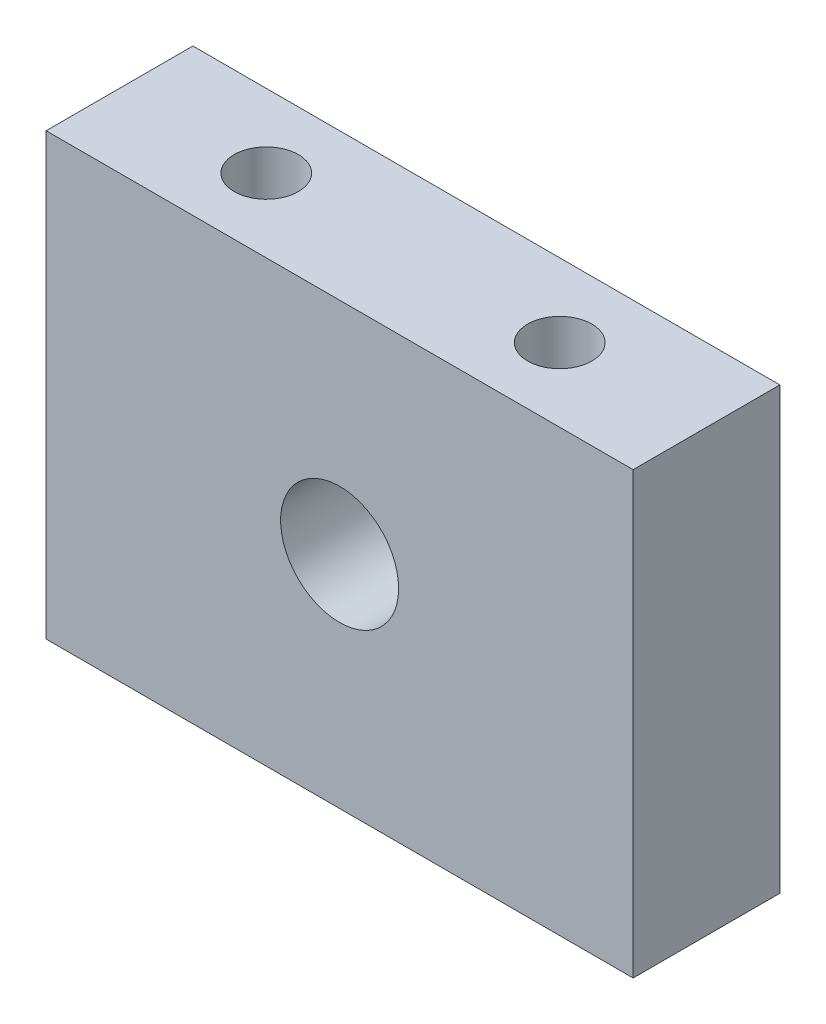
ISO-10303-21;
HEADER;
FILE_DESCRIPTION(('STEP AP214'),'2;1');
FILE_NAME('part.step','',(''),(''),'','','');
FILE_SCHEMA(('AUTOMOTIVE_DESIGN { 1 0 10303 214 1 1 1 1 }'));
ENDSEC;
DATA;
#1=APPLICATION_CONTEXT('core data for automotive mechanical design processes');
#2=APPLICATION_PROTOCOL_DEFINITION('international standard','automotive_design',2000,#1);
#3=PRODUCT_CONTEXT('',#1,'mechanical');
#4=PRODUCT('Part','Part','',(#3));
#5=PRODUCT_RELATED_PRODUCT_CATEGORY('part','',(#4));
#6=PRODUCT_DEFINITION_FORMATION('','',#4);
#7=PRODUCT_DEFINITION_CONTEXT('part definition',#1,'design');
#8=PRODUCT_DEFINITION('design','',#6,#7);
#9=PRODUCT_DEFINITION_SHAPE('','',#8);
#10=(LENGTH_UNIT() NAMED_UNIT(*) SI_UNIT(.MILLI.,.METRE.));
#11=(NAMED_UNIT(*) PLANE_ANGLE_UNIT() SI_UNIT($,.RADIAN.));
#12=(NAMED_UNIT(*) SI_UNIT($,.STERADIAN.) SOLID_ANGLE_UNIT());
#13=UNCERTAINTY_MEASURE_WITH_UNIT(LENGTH_MEASURE(1.E-05),#10,'distance_accuracy_value','');
#14=(GEOMETRIC_REPRESENTATION_CONTEXT(3) GLOBAL_UNCERTAINTY_ASSIGNED_CONTEXT((#13)) GLOBAL_UNIT_ASSIGNED_CONTEXT((#10,
#11,#12)) REPRESENTATION_CONTEXT('',''));
#15=CARTESIAN_POINT('',(0.,0.,0.));
#16=DIRECTION('',(0.,0.,1.));
#17=DIRECTION('',(1.,0.,0.));
#18=AXIS2_PLACEMENT_3D('',#15,#16,#17);
#19=CARTESIAN_POINT('',(12.7,9.525,3.175));
#20=DIRECTION('',(-1.,0.,0.));
#21=DIRECTION('',(0.,-1.,0.));
#22=AXIS2_PLACEMENT_3D('',#19,#20,#21);
#23=PLANE('',#22);
#24=DIRECTION('',(0.,1.,0.));
#25=VECTOR('',#24,1.);
#26=CARTESIAN_POINT('',(12.7,9.525,-3.175));
#27=LINE('',#26,#25);
#28=CARTESIAN_POINT('',(12.7,-9.525,-3.175));
#29=VERTEX_POINT('',#28);
#30=CARTESIAN_POINT('',(12.7,9.525,-3.175));
#31=VERTEX_POINT('',#30);
#32=EDGE_CURVE('E96',#29,#31,#27,.T.);
#33=ORIENTED_EDGE('',*,*,#32,.T.);
#34=DIRECTION('',(0.,0.,-1.));
#35=VECTOR('',#34,1.);
#36=CARTESIAN_POINT('',(12.7,9.525,3.175));
#37=LINE('',#36,#35);
#38=CARTESIAN_POINT('',(12.7,9.525,3.175));
#39=VERTEX_POINT('',#38);
#40=EDGE_CURVE('E11',#39,#31,#37,.T.);
#41=ORIENTED_EDGE('',*,*,#40,.F.);
#42=DIRECTION('',(0.,1.,0.));
#43=VECTOR('',#42,1.);
#44=CARTESIAN_POINT('',(12.7,9.525,3.175));
#45=LINE('',#44,#43);
#46=CARTESIAN_POINT('',(12.7,-9.525,3.175));
#47=VERTEX_POINT('',#46);
#48=EDGE_CURVE('E84',#47,#39,#45,.T.);
#49=ORIENTED_EDGE('',*,*,#48,.F.);
#50=DIRECTION('',(0.,0.,-1.));
#51=VECTOR('',#50,1.);
#52=CARTESIAN_POINT('',(12.7,-9.525,3.175));
#53=LINE('',#52,#51);
#54=EDGE_CURVE('E92',#47,#29,#53,.T.);
#55=ORIENTED_EDGE('',*,*,#54,.T.);
#56=EDGE_LOOP('',(#33,#41,#49,#55));
#57=FACE_BOUND('',#56,.T.);
#58=ADVANCED_FACE('F33',(#57),#23,.F.);
#59=CARTESIAN_POINT('',(-12.7,9.525,3.175));
#60=DIRECTION('',(0.,-1.,0.));
#61=DIRECTION('',(0.,0.,-1.));
#62=AXIS2_PLACEMENT_3D('',#59,#60,#61);
#63=PLANE('',#62);
#64=CARTESIAN_POINT('',(6.35,9.525,0.));
#65=DIRECTION('',(0.,1.,0.));
#66=DIRECTION('',(0.,0.,-1.));
#67=AXIS2_PLACEMENT_3D('',#64,#65,#66);
#68=CIRCLE('',#67,1.3890625);
#69=CARTESIAN_POINT('',(6.35,9.525,-1.3890625));
#70=VERTEX_POINT('',#69);
#71=EDGE_CURVE('E122',#70,#70,#68,.T.);
#72=ORIENTED_EDGE('',*,*,#71,.F.);
#73=EDGE_LOOP('',(#72));
#74=FACE_BOUND('',#73,.T.);
#75=CARTESIAN_POINT('',(-6.35,9.525,0.));
#76=DIRECTION('',(0.,1.,0.));
#77=DIRECTION('',(0.,0.,1.));
#78=AXIS2_PLACEMENT_3D('',#75,#76,#77);
#79=CIRCLE('',#78,1.3890625);
#80=CARTESIAN_POINT('',(-6.35,9.525,1.3890625));
#81=VERTEX_POINT('',#80);
#82=EDGE_CURVE('E116',#81,#81,#79,.T.);
#83=ORIENTED_EDGE('',*,*,#82,.F.);
#84=EDGE_LOOP('',(#83));
#85=FACE_BOUND('',#84,.T.);
#86=DIRECTION('',(-1.,0.,0.));
#87=VECTOR('',#86,1.);
#88=CARTESIAN_POINT('',(-12.7,9.525,-3.175));
#89=LINE('',#88,#87);
#90=CARTESIAN_POINT('',(-12.7,9.525,-3.175));
#91=VERTEX_POINT('',#90);
#92=EDGE_CURVE('E88',#31,#91,#89,.T.);
#93=ORIENTED_EDGE('',*,*,#92,.T.);
#94=DIRECTION('',(0.,0.,-1.));
#95=VECTOR('',#94,1.);
#96=CARTESIAN_POINT('',(-12.7,9.525,3.175));
#97=LINE('',#96,#95);
#98=CARTESIAN_POINT('',(-12.7,9.525,3.175));
#99=VERTEX_POINT('',#98);
#100=EDGE_CURVE('E41',#99,#91,#97,.T.);
#101=ORIENTED_EDGE('',*,*,#100,.F.);
#102=DIRECTION('',(-1.,0.,0.));
#103=VECTOR('',#102,1.);
#104=CARTESIAN_POINT('',(-12.7,9.525,3.175));
#105=LINE('',#104,#103);
#106=EDGE_CURVE('E79',#39,#99,#105,.T.);
#107=ORIENTED_EDGE('',*,*,#106,.F.);
#108=ORIENTED_EDGE('',*,*,#40,.T.);
#109=EDGE_LOOP('',(#93,#101,#107,#108));
#110=FACE_BOUND('',#109,.T.);
#111=ADVANCED_FACE('F87',(#74,#85,#110),#63,.F.);
#112=CARTESIAN_POINT('',(-12.7,9.525,3.175));
#113=DIRECTION('',(1.,0.,0.));
#114=DIRECTION('',(0.,1.,0.));
#115=AXIS2_PLACEMENT_3D('',#112,#113,#114);
#116=PLANE('',#115);
#117=DIRECTION('',(0.,-1.,0.));
#118=VECTOR('',#117,1.);
#119=CARTESIAN_POINT('',(-12.7,9.525,-3.175));
#120=LINE('',#119,#118);
#121=CARTESIAN_POINT('',(-12.7,-9.525,-3.175));
#122=VERTEX_POINT('',#121);
#123=EDGE_CURVE('E66',#91,#122,#120,.T.);
#124=ORIENTED_EDGE('',*,*,#123,.T.);
#125=DIRECTION('',(0.,0.,-1.));
#126=VECTOR('',#125,1.);
#127=CARTESIAN_POINT('',(-12.7,-9.525,3.175));
#128=LINE('',#127,#126);
#129=CARTESIAN_POINT('',(-12.7,-9.525,3.175));
#130=VERTEX_POINT('',#129);
#131=EDGE_CURVE('E89',#130,#122,#128,.T.);
#132=ORIENTED_EDGE('',*,*,#131,.F.);
#133=DIRECTION('',(0.,-1.,0.));
#134=VECTOR('',#133,1.);
#135=CARTESIAN_POINT('',(-12.7,9.525,3.175));
#136=LINE('',#135,#134);
#137=EDGE_CURVE('E82',#99,#130,#136,.T.);
#138=ORIENTED_EDGE('',*,*,#137,.F.);
#139=ORIENTED_EDGE('',*,*,#100,.T.);
#140=EDGE_LOOP('',(#124,#132,#138,#139));
#141=FACE_BOUND('',#140,.T.);
#142=ADVANCED_FACE('F90',(#141),#116,.F.);
#143=CARTESIAN_POINT('',(-12.7,-9.525,3.175));
#144=DIRECTION('',(0.,1.,0.));
#145=DIRECTION('',(0.,0.,1.));
#146=AXIS2_PLACEMENT_3D('',#143,#144,#145);
#147=PLANE('',#146);
#148=CARTESIAN_POINT('',(-6.34999999999999,-9.525,0.));
#149=DIRECTION('',(0.,-1.,0.));
#150=DIRECTION('',(0.,0.,1.));
#151=AXIS2_PLACEMENT_3D('',#148,#149,#150);
#152=CIRCLE('',#151,1.3890625);
#153=CARTESIAN_POINT('',(-6.34999999999999,-9.525,1.3890625));
#154=VERTEX_POINT('',#153);
#155=EDGE_CURVE('E134',#154,#154,#152,.T.);
#156=ORIENTED_EDGE('',*,*,#155,.F.);
#157=EDGE_LOOP('',(#156));
#158=FACE_BOUND('',#157,.T.);
#159=CARTESIAN_POINT('',(6.35,-9.525,0.));
#160=DIRECTION('',(0.,-1.,0.));
#161=DIRECTION('',(0.,0.,-1.));
#162=AXIS2_PLACEMENT_3D('',#159,#160,#161);
#163=CIRCLE('',#162,1.3890625);
#164=CARTESIAN_POINT('',(6.35,-9.525,-1.3890625));
#165=VERTEX_POINT('',#164);
#166=EDGE_CURVE('E128',#165,#165,#163,.T.);
#167=ORIENTED_EDGE('',*,*,#166,.F.);
#168=EDGE_LOOP('',(#167));
#169=FACE_BOUND('',#168,.T.);
#170=DIRECTION('',(1.,0.,0.));
#171=VECTOR('',#170,1.);
#172=CARTESIAN_POINT('',(-12.7,-9.525,-3.175));
#173=LINE('',#172,#171);
#174=EDGE_CURVE('E72',#122,#29,#173,.T.);
#175=ORIENTED_EDGE('',*,*,#174,.T.);
#176=ORIENTED_EDGE('',*,*,#54,.F.);
#177=DIRECTION('',(1.,0.,0.));
#178=VECTOR('',#177,1.);
#179=CARTESIAN_POINT('',(-12.7,-9.525,3.175));
#180=LINE('',#179,#178);
#181=EDGE_CURVE('E49',#130,#47,#180,.T.);
#182=ORIENTED_EDGE('',*,*,#181,.F.);
#183=ORIENTED_EDGE('',*,*,#131,.T.);
#184=EDGE_LOOP('',(#175,#176,#182,#183));
#185=FACE_BOUND('',#184,.T.);
#186=ADVANCED_FACE('F104',(#158,#169,#185),#147,.F.);
#187=CARTESIAN_POINT('',(0.,0.,3.175));
#188=DIRECTION('',(0.,0.,1.));
#189=DIRECTION('',(1.,0.,0.));
#190=AXIS2_PLACEMENT_3D('',#187,#188,#189);
#191=PLANE('',#190);
#192=CARTESIAN_POINT('',(0.,0.,3.175));
#193=DIRECTION('',(0.,0.,1.));
#194=DIRECTION('',(1.,0.,0.));
#195=AXIS2_PLACEMENT_3D('',#192,#193,#194);
#196=CIRCLE('',#195,2.5527);
#197=CARTESIAN_POINT('',(2.5527,0.,3.175));
#198=VERTEX_POINT('',#197);
#199=EDGE_CURVE('E110',#198,#198,#196,.T.);
#200=ORIENTED_EDGE('',*,*,#199,.F.);
#201=EDGE_LOOP('',(#200));
#202=FACE_BOUND('',#201,.T.);
#203=ORIENTED_EDGE('',*,*,#48,.T.);
#204=ORIENTED_EDGE('',*,*,#106,.T.);
#205=ORIENTED_EDGE('',*,*,#137,.T.);
#206=ORIENTED_EDGE('',*,*,#181,.T.);
#207=EDGE_LOOP('',(#203,#204,#205,#206));
#208=FACE_BOUND('',#207,.T.);
#209=ADVANCED_FACE('F80',(#202,#208),#191,.T.);
#210=CARTESIAN_POINT('',(0.,0.,-3.175));
#211=DIRECTION('',(0.,0.,1.));
#212=DIRECTION('',(1.,0.,0.));
#213=AXIS2_PLACEMENT_3D('',#210,#211,#212);
#214=PLANE('',#213);
#215=CARTESIAN_POINT('',(0.,0.,-3.175));
#216=DIRECTION('',(0.,0.,1.));
#217=DIRECTION('',(1.,0.,0.));
#218=AXIS2_PLACEMENT_3D('',#215,#216,#217);
#219=CIRCLE('',#218,2.5527);
#220=CARTESIAN_POINT('',(2.5527,0.,-3.175));
#221=VERTEX_POINT('',#220);
#222=EDGE_CURVE('E99',#221,#221,#219,.T.);
#223=ORIENTED_EDGE('',*,*,#222,.T.);
#224=EDGE_LOOP('',(#223));
#225=FACE_BOUND('',#224,.T.);
#226=ORIENTED_EDGE('',*,*,#32,.F.);
#227=ORIENTED_EDGE('',*,*,#174,.F.);
#228=ORIENTED_EDGE('',*,*,#123,.F.);
#229=ORIENTED_EDGE('',*,*,#92,.F.);
#230=EDGE_LOOP('',(#226,#227,#228,#229));
#231=FACE_BOUND('',#230,.T.);
#232=ADVANCED_FACE('F107',(#225,#231),#214,.F.);
#233=CARTESIAN_POINT('',(0.,0.,-3.175));
#234=DIRECTION('',(0.,0.,1.));
#235=DIRECTION('',(1.,0.,0.));
#236=AXIS2_PLACEMENT_3D('',#233,#234,#235);
#237=CYLINDRICAL_SURFACE('',#236,2.5527);
#238=ORIENTED_EDGE('',*,*,#222,.F.);
#239=EDGE_LOOP('',(#238));
#240=FACE_BOUND('',#239,.T.);
#241=ORIENTED_EDGE('',*,*,#199,.T.);
#242=EDGE_LOOP('',(#241));
#243=FACE_BOUND('',#242,.T.);
#244=ADVANCED_FACE('F183',(#240,#243),#237,.F.);
#245=CARTESIAN_POINT('',(-6.35,3.175,0.));
#246=DIRECTION('',(0.,1.,0.));
#247=DIRECTION('',(0.,0.,1.));
#248=AXIS2_PLACEMENT_3D('',#245,#246,#247);
#249=CYLINDRICAL_SURFACE('',#248,1.3890625);
#250=CARTESIAN_POINT('',(-6.35,3.175,0.));
#251=DIRECTION('',(0.,1.,0.));
#252=DIRECTION('',(0.,0.,1.));
#253=AXIS2_PLACEMENT_3D('',#250,#251,#252);
#254=CIRCLE('',#253,1.3890625);
#255=CARTESIAN_POINT('',(-6.35,3.175,1.3890625));
#256=VERTEX_POINT('',#255);
#257=EDGE_CURVE('E113',#256,#256,#254,.T.);
#258=ORIENTED_EDGE('',*,*,#257,.F.);
#259=EDGE_LOOP('',(#258));
#260=FACE_BOUND('',#259,.T.);
#261=ORIENTED_EDGE('',*,*,#82,.T.);
#262=EDGE_LOOP('',(#261));
#263=FACE_BOUND('',#262,.T.);
#264=ADVANCED_FACE('F190',(#260,#263),#249,.F.);
#265=CARTESIAN_POINT('',(-6.35,3.175,0.));
#266=DIRECTION('',(0.,1.,0.));
#267=DIRECTION('',(0.,0.,1.));
#268=AXIS2_PLACEMENT_3D('',#265,#266,#267);
#269=PLANE('',#268);
#270=ORIENTED_EDGE('',*,*,#257,.T.);
#271=EDGE_LOOP('',(#270));
#272=FACE_BOUND('',#271,.T.);
#273=ADVANCED_FACE('F194',(#272),#269,.T.);
#274=CARTESIAN_POINT('',(6.35,3.175,0.));
#275=DIRECTION('',(0.,1.,0.));
#276=DIRECTION('',(0.,0.,1.));
#277=AXIS2_PLACEMENT_3D('',#274,#275,#276);
#278=CYLINDRICAL_SURFACE('',#277,1.3890625);
#279=CARTESIAN_POINT('',(6.35,3.175,0.));
#280=DIRECTION('',(0.,1.,0.));
#281=DIRECTION('',(0.,0.,-1.));
#282=AXIS2_PLACEMENT_3D('',#279,#280,#281);
#283=CIRCLE('',#282,1.3890625);
#284=CARTESIAN_POINT('',(6.35,3.175,-1.3890625));
#285=VERTEX_POINT('',#284);
#286=EDGE_CURVE('E119',#285,#285,#283,.T.);
#287=ORIENTED_EDGE('',*,*,#286,.F.);
#288=EDGE_LOOP('',(#287));
#289=FACE_BOUND('',#288,.T.);
#290=ORIENTED_EDGE('',*,*,#71,.T.);
#291=EDGE_LOOP('',(#290));
#292=FACE_BOUND('',#291,.T.);
#293=ADVANCED_FACE('F165',(#289,#292),#278,.F.);
#294=CARTESIAN_POINT('',(6.35,3.175,0.));
#295=DIRECTION('',(0.,-1.,0.));
#296=DIRECTION('',(0.,0.,-1.));
#297=AXIS2_PLACEMENT_3D('',#294,#295,#296);
#298=PLANE('',#297);
#299=ORIENTED_EDGE('',*,*,#286,.T.);
#300=EDGE_LOOP('',(#299));
#301=FACE_BOUND('',#300,.T.);
#302=ADVANCED_FACE('F156',(#301),#298,.F.);
#303=CARTESIAN_POINT('',(6.35,-3.175,0.));
#304=DIRECTION('',(0.,-1.,0.));
#305=DIRECTION('',(0.,0.,-1.));
#306=AXIS2_PLACEMENT_3D('',#303,#304,#305);
#307=CYLINDRICAL_SURFACE('',#306,1.3890625);
#308=CARTESIAN_POINT('',(6.35,-3.175,0.));
#309=DIRECTION('',(0.,-1.,0.));
#310=DIRECTION('',(0.,0.,-1.));
#311=AXIS2_PLACEMENT_3D('',#308,#309,#310);
#312=CIRCLE('',#311,1.3890625);
#313=CARTESIAN_POINT('',(6.35,-3.175,-1.3890625));
#314=VERTEX_POINT('',#313);
#315=EDGE_CURVE('E125',#314,#314,#312,.T.);
#316=ORIENTED_EDGE('',*,*,#315,.F.);
#317=EDGE_LOOP('',(#316));
#318=FACE_BOUND('',#317,.T.);
#319=ORIENTED_EDGE('',*,*,#166,.T.);
#320=EDGE_LOOP('',(#319));
#321=FACE_BOUND('',#320,.T.);
#322=ADVANCED_FACE('F154',(#318,#321),#307,.F.);
#323=CARTESIAN_POINT('',(6.35,-3.175,0.));
#324=DIRECTION('',(0.,-1.,0.));
#325=DIRECTION('',(0.,0.,-1.));
#326=AXIS2_PLACEMENT_3D('',#323,#324,#325);
#327=PLANE('',#326);
#328=ORIENTED_EDGE('',*,*,#315,.T.);
#329=EDGE_LOOP('',(#328));
#330=FACE_BOUND('',#329,.T.);
#331=ADVANCED_FACE('F145',(#330),#327,.T.);
#332=CARTESIAN_POINT('',(-6.34999999999999,-3.175,0.));
#333=DIRECTION('',(0.,-1.,0.));
#334=DIRECTION('',(0.,0.,-1.));
#335=AXIS2_PLACEMENT_3D('',#332,#333,#334);
#336=CYLINDRICAL_SURFACE('',#335,1.3890625);
#337=CARTESIAN_POINT('',(-6.34999999999999,-3.175,0.));
#338=DIRECTION('',(0.,-1.,0.));
#339=DIRECTION('',(0.,0.,1.));
#340=AXIS2_PLACEMENT_3D('',#337,#338,#339);
#341=CIRCLE('',#340,1.3890625);
#342=CARTESIAN_POINT('',(-6.34999999999999,-3.175,1.3890625));
#343=VERTEX_POINT('',#342);
#344=EDGE_CURVE('E131',#343,#343,#341,.T.);
#345=ORIENTED_EDGE('',*,*,#344,.F.);
#346=EDGE_LOOP('',(#345));
#347=FACE_BOUND('',#346,.T.);
#348=ORIENTED_EDGE('',*,*,#155,.T.);
#349=EDGE_LOOP('',(#348));
#350=FACE_BOUND('',#349,.T.);
#351=ADVANCED_FACE('F142',(#347,#350),#336,.F.);
#352=CARTESIAN_POINT('',(-6.34999999999999,-3.175,0.));
#353=DIRECTION('',(0.,1.,0.));
#354=DIRECTION('',(0.,0.,1.));
#355=AXIS2_PLACEMENT_3D('',#352,#353,#354);
#356=PLANE('',#355);
#357=ORIENTED_EDGE('',*,*,#344,.T.);
#358=EDGE_LOOP('',(#357));
#359=FACE_BOUND('',#358,.T.);
#360=ADVANCED_FACE('F140',(#359),#356,.F.);
#361=CLOSED_SHELL('',(#58,#111,#142,#186,#209,#232,#244,#264,#273,#293,#302,#322,#331,#351,#360));
#362=MANIFOLD_SOLID_BREP('B2',#361);
#363=ADVANCED_BREP_SHAPE_REPRESENTATION('',(#18,#362),#14);
#364=SHAPE_DEFINITION_REPRESENTATION(#9,#363);
ENDSEC;
END-ISO-10303-21;
